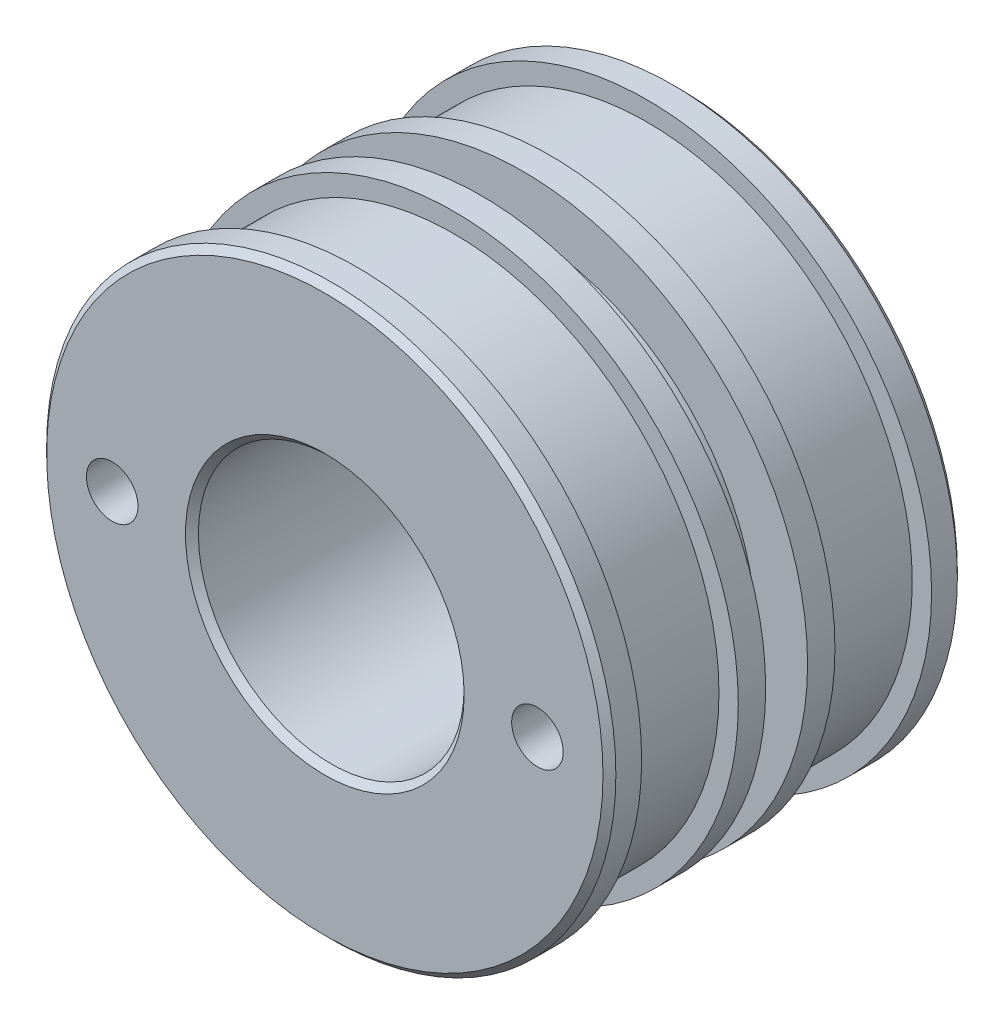
ISO-10303-21;
HEADER;
FILE_DESCRIPTION(('STEP AP214'),'2;1');
FILE_NAME('part.step','',(''),(''),'','','');
FILE_SCHEMA(('AUTOMOTIVE_DESIGN { 1 0 10303 214 1 1 1 1 }'));
ENDSEC;
DATA;
#1=APPLICATION_CONTEXT('core data for automotive mechanical design processes');
#2=APPLICATION_PROTOCOL_DEFINITION('international standard','automotive_design',2000,#1);
#3=PRODUCT_CONTEXT('',#1,'mechanical');
#4=PRODUCT('Part','Part','',(#3));
#5=PRODUCT_RELATED_PRODUCT_CATEGORY('part','',(#4));
#6=PRODUCT_DEFINITION_FORMATION('','',#4);
#7=PRODUCT_DEFINITION_CONTEXT('part definition',#1,'design');
#8=PRODUCT_DEFINITION('design','',#6,#7);
#9=PRODUCT_DEFINITION_SHAPE('','',#8);
#10=(LENGTH_UNIT() NAMED_UNIT(*) SI_UNIT(.MILLI.,.METRE.));
#11=(NAMED_UNIT(*) PLANE_ANGLE_UNIT() SI_UNIT($,.RADIAN.));
#12=(NAMED_UNIT(*) SI_UNIT($,.STERADIAN.) SOLID_ANGLE_UNIT());
#13=UNCERTAINTY_MEASURE_WITH_UNIT(LENGTH_MEASURE(1.E-05),#10,'distance_accuracy_value','');
#14=(GEOMETRIC_REPRESENTATION_CONTEXT(3) GLOBAL_UNCERTAINTY_ASSIGNED_CONTEXT((#13)) GLOBAL_UNIT_ASSIGNED_CONTEXT((#10,
#11,#12)) REPRESENTATION_CONTEXT('',''));
#15=CARTESIAN_POINT('',(0.,0.,0.));
#16=DIRECTION('',(0.,0.,1.));
#17=DIRECTION('',(1.,0.,0.));
#18=AXIS2_PLACEMENT_3D('',#15,#16,#17);
#19=CARTESIAN_POINT('',(0.,0.,-55.));
#20=DIRECTION('',(0.,0.,1.));
#21=DIRECTION('',(1.,0.,0.));
#22=AXIS2_PLACEMENT_3D('',#19,#20,#21);
#23=CYLINDRICAL_SURFACE('',#22,20.625);
#24=CARTESIAN_POINT('',(0.,0.,-1.00000000000002));
#25=DIRECTION('',(0.,0.,1.));
#26=DIRECTION('',(1.,0.,0.));
#27=AXIS2_PLACEMENT_3D('',#24,#25,#26);
#28=CIRCLE('',#27,20.625);
#29=CARTESIAN_POINT('',(20.625,0.,-1.00000000000002));
#30=VERTEX_POINT('',#29);
#31=EDGE_CURVE('E65',#30,#30,#28,.T.);
#32=ORIENTED_EDGE('',*,*,#31,.T.);
#33=EDGE_LOOP('',(#32));
#34=FACE_BOUND('',#33,.T.);
#35=CARTESIAN_POINT('',(0.,0.,-40.));
#36=DIRECTION('',(0.,0.,-1.));
#37=DIRECTION('',(-1.,0.,0.));
#38=AXIS2_PLACEMENT_3D('',#35,#36,#37);
#39=CIRCLE('',#38,20.625);
#40=CARTESIAN_POINT('',(-20.625,0.,-40.));
#41=VERTEX_POINT('',#40);
#42=EDGE_CURVE('E55',#41,#41,#39,.F.);
#43=ORIENTED_EDGE('',*,*,#42,.F.);
#44=EDGE_LOOP('',(#43));
#45=FACE_BOUND('',#44,.T.);
#46=ADVANCED_FACE('F36',(#34,#45),#23,.F.);
#47=CARTESIAN_POINT('',(0.,0.,-55.));
#48=DIRECTION('',(0.,0.,1.));
#49=DIRECTION('',(1.,0.,0.));
#50=AXIS2_PLACEMENT_3D('',#47,#48,#49);
#51=CYLINDRICAL_SURFACE('',#50,44.175);
#52=CARTESIAN_POINT('',(0.,0.,-1.00000000000004));
#53=DIRECTION('',(0.,0.,1.));
#54=DIRECTION('',(1.,0.,0.));
#55=AXIS2_PLACEMENT_3D('',#52,#53,#54);
#56=CIRCLE('',#55,44.175);
#57=CARTESIAN_POINT('',(44.175,0.,-1.00000000000004));
#58=VERTEX_POINT('',#57);
#59=EDGE_CURVE('E48',#58,#58,#56,.F.);
#60=ORIENTED_EDGE('',*,*,#59,.T.);
#61=EDGE_LOOP('',(#60));
#62=FACE_BOUND('',#61,.T.);
#63=CARTESIAN_POINT('',(0.,0.,-5.));
#64=DIRECTION('',(0.,0.,1.));
#65=DIRECTION('',(1.,0.,0.));
#66=AXIS2_PLACEMENT_3D('',#63,#64,#65);
#67=CIRCLE('',#66,44.175);
#68=CARTESIAN_POINT('',(44.175,0.,-5.));
#69=VERTEX_POINT('',#68);
#70=EDGE_CURVE('E90',#69,#69,#67,.T.);
#71=ORIENTED_EDGE('',*,*,#70,.T.);
#72=EDGE_LOOP('',(#71));
#73=FACE_BOUND('',#72,.T.);
#74=ADVANCED_FACE('F163',(#62,#73),#51,.T.);
#75=CARTESIAN_POINT('',(0.,0.,-54.));
#76=DIRECTION('',(0.,0.,1.));
#77=DIRECTION('',(1.,0.,0.));
#78=AXIS2_PLACEMENT_3D('',#75,#76,#77);
#79=CIRCLE('',#78,44.175);
#80=CARTESIAN_POINT('',(44.175,0.,-54.));
#81=VERTEX_POINT('',#80);
#82=EDGE_CURVE('E71',#81,#81,#79,.T.);
#83=ORIENTED_EDGE('',*,*,#82,.T.);
#84=EDGE_LOOP('',(#83));
#85=FACE_BOUND('',#84,.T.);
#86=CARTESIAN_POINT('',(0.,0.,-50.));
#87=DIRECTION('',(0.,0.,1.));
#88=DIRECTION('',(1.,0.,0.));
#89=AXIS2_PLACEMENT_3D('',#86,#87,#88);
#90=CIRCLE('',#89,44.175);
#91=CARTESIAN_POINT('',(44.175,0.,-50.));
#92=VERTEX_POINT('',#91);
#93=EDGE_CURVE('E82',#92,#92,#90,.T.);
#94=ORIENTED_EDGE('',*,*,#93,.F.);
#95=EDGE_LOOP('',(#94));
#96=FACE_BOUND('',#95,.T.);
#97=ADVANCED_FACE('F169',(#85,#96),#51,.T.);
#98=CARTESIAN_POINT('',(0.,0.,-55.));
#99=DIRECTION('',(0.,0.,1.));
#100=DIRECTION('',(1.,0.,0.));
#101=AXIS2_PLACEMENT_3D('',#98,#99,#100);
#102=PLANE('',#101);
#103=CARTESIAN_POINT('',(0.,0.,-55.));
#104=DIRECTION('',(0.,0.,1.));
#105=DIRECTION('',(1.,0.,0.));
#106=AXIS2_PLACEMENT_3D('',#103,#104,#105);
#107=CIRCLE('',#106,25.5);
#108=CARTESIAN_POINT('',(25.5,0.,-55.));
#109=VERTEX_POINT('',#108);
#110=EDGE_CURVE('E10',#109,#109,#107,.T.);
#111=ORIENTED_EDGE('',*,*,#110,.T.);
#112=EDGE_LOOP('',(#111));
#113=FACE_BOUND('',#112,.T.);
#114=CARTESIAN_POINT('',(0.,0.,-55.));
#115=DIRECTION('',(0.,0.,1.));
#116=DIRECTION('',(1.,0.,0.));
#117=AXIS2_PLACEMENT_3D('',#114,#115,#116);
#118=CIRCLE('',#117,43.175);
#119=CARTESIAN_POINT('',(43.175,0.,-55.));
#120=VERTEX_POINT('',#119);
#121=EDGE_CURVE('E68',#120,#120,#118,.F.);
#122=ORIENTED_EDGE('',*,*,#121,.T.);
#123=EDGE_LOOP('',(#122));
#124=FACE_BOUND('',#123,.T.);
#125=ADVANCED_FACE('F137',(#113,#124),#102,.F.);
#126=CARTESIAN_POINT('',(0.,0.,0.));
#127=DIRECTION('',(0.,0.,1.));
#128=DIRECTION('',(1.,0.,0.));
#129=AXIS2_PLACEMENT_3D('',#126,#127,#128);
#130=PLANE('',#129);
#131=CARTESIAN_POINT('',(-33.,0.,0.));
#132=DIRECTION('',(0.,0.,1.));
#133=DIRECTION('',(1.,0.,0.));
#134=AXIS2_PLACEMENT_3D('',#131,#132,#133);
#135=CIRCLE('',#134,4.);
#136=CARTESIAN_POINT('',(-29.,0.,0.));
#137=VERTEX_POINT('',#136);
#138=EDGE_CURVE('E118',#137,#137,#135,.T.);
#139=ORIENTED_EDGE('',*,*,#138,.F.);
#140=EDGE_LOOP('',(#139));
#141=FACE_BOUND('',#140,.T.);
#142=CARTESIAN_POINT('',(33.,0.,0.));
#143=DIRECTION('',(0.,0.,1.));
#144=DIRECTION('',(1.,0.,0.));
#145=AXIS2_PLACEMENT_3D('',#142,#143,#144);
#146=CIRCLE('',#145,4.00000000000001);
#147=CARTESIAN_POINT('',(37.,0.,0.));
#148=VERTEX_POINT('',#147);
#149=EDGE_CURVE('E112',#148,#148,#146,.T.);
#150=ORIENTED_EDGE('',*,*,#149,.F.);
#151=EDGE_LOOP('',(#150));
#152=FACE_BOUND('',#151,.T.);
#153=CARTESIAN_POINT('',(0.,0.,0.));
#154=DIRECTION('',(0.,0.,1.));
#155=DIRECTION('',(1.,0.,0.));
#156=AXIS2_PLACEMENT_3D('',#153,#154,#155);
#157=CIRCLE('',#156,21.625);
#158=CARTESIAN_POINT('',(21.625,0.,0.));
#159=VERTEX_POINT('',#158);
#160=EDGE_CURVE('E52',#159,#159,#157,.F.);
#161=ORIENTED_EDGE('',*,*,#160,.T.);
#162=EDGE_LOOP('',(#161));
#163=FACE_BOUND('',#162,.T.);
#164=CARTESIAN_POINT('',(0.,0.,0.));
#165=DIRECTION('',(0.,0.,1.));
#166=DIRECTION('',(1.,0.,0.));
#167=AXIS2_PLACEMENT_3D('',#164,#165,#166);
#168=CIRCLE('',#167,43.175);
#169=CARTESIAN_POINT('',(43.175,0.,0.));
#170=VERTEX_POINT('',#169);
#171=EDGE_CURVE('E62',#170,#170,#168,.T.);
#172=ORIENTED_EDGE('',*,*,#171,.T.);
#173=EDGE_LOOP('',(#172));
#174=FACE_BOUND('',#173,.T.);
#175=ADVANCED_FACE('F133',(#141,#152,#163,#174),#130,.T.);
#176=CARTESIAN_POINT('',(0.,44.175,-35.));
#177=DIRECTION('',(0.,0.,-1.));
#178=DIRECTION('',(-1.,0.,0.));
#179=AXIS2_PLACEMENT_3D('',#176,#177,#178);
#180=PLANE('',#179);
#181=CARTESIAN_POINT('',(0.,0.,-35.));
#182=DIRECTION('',(0.,0.,1.));
#183=DIRECTION('',(1.,0.,0.));
#184=AXIS2_PLACEMENT_3D('',#181,#182,#183);
#185=CIRCLE('',#184,41.175);
#186=CARTESIAN_POINT('',(41.175,0.,-35.));
#187=VERTEX_POINT('',#186);
#188=EDGE_CURVE('E75',#187,#187,#185,.T.);
#189=ORIENTED_EDGE('',*,*,#188,.T.);
#190=EDGE_LOOP('',(#189));
#191=FACE_BOUND('',#190,.T.);
#192=CARTESIAN_POINT('',(0.,0.,-35.));
#193=DIRECTION('',(0.,0.,1.));
#194=DIRECTION('',(1.,0.,0.));
#195=AXIS2_PLACEMENT_3D('',#192,#193,#194);
#196=CIRCLE('',#195,44.175);
#197=CARTESIAN_POINT('',(44.175,0.,-35.));
#198=VERTEX_POINT('',#197);
#199=EDGE_CURVE('E57',#198,#198,#196,.T.);
#200=ORIENTED_EDGE('',*,*,#199,.F.);
#201=EDGE_LOOP('',(#200));
#202=FACE_BOUND('',#201,.T.);
#203=ADVANCED_FACE('F136',(#191,#202),#180,.T.);
#204=CARTESIAN_POINT('',(0.,0.,0.));
#205=DIRECTION('',(0.,0.,1.));
#206=DIRECTION('',(1.,0.,0.));
#207=AXIS2_PLACEMENT_3D('',#204,#205,#206);
#208=CYLINDRICAL_SURFACE('',#207,41.175);
#209=CARTESIAN_POINT('',(0.,0.,-50.));
#210=DIRECTION('',(0.,0.,1.));
#211=DIRECTION('',(1.,0.,0.));
#212=AXIS2_PLACEMENT_3D('',#209,#210,#211);
#213=CIRCLE('',#212,41.175);
#214=CARTESIAN_POINT('',(41.175,0.,-50.));
#215=VERTEX_POINT('',#214);
#216=EDGE_CURVE('E79',#215,#215,#213,.T.);
#217=ORIENTED_EDGE('',*,*,#216,.T.);
#218=EDGE_LOOP('',(#217));
#219=FACE_BOUND('',#218,.T.);
#220=ORIENTED_EDGE('',*,*,#188,.F.);
#221=EDGE_LOOP('',(#220));
#222=FACE_BOUND('',#221,.T.);
#223=ADVANCED_FACE('F210',(#219,#222),#208,.T.);
#224=CARTESIAN_POINT('',(0.,44.175,-50.));
#225=DIRECTION('',(0.,0.,1.));
#226=DIRECTION('',(1.,0.,0.));
#227=AXIS2_PLACEMENT_3D('',#224,#225,#226);
#228=PLANE('',#227);
#229=ORIENTED_EDGE('',*,*,#93,.T.);
#230=EDGE_LOOP('',(#229));
#231=FACE_BOUND('',#230,.T.);
#232=ORIENTED_EDGE('',*,*,#216,.F.);
#233=EDGE_LOOP('',(#232));
#234=FACE_BOUND('',#233,.T.);
#235=ADVANCED_FACE('F207',(#231,#234),#228,.T.);
#236=ORIENTED_EDGE('',*,*,#199,.T.);
#237=EDGE_LOOP('',(#236));
#238=FACE_BOUND('',#237,.T.);
#239=CARTESIAN_POINT('',(0.,0.,-30.75));
#240=DIRECTION('',(0.,0.,1.));
#241=DIRECTION('',(1.,0.,0.));
#242=AXIS2_PLACEMENT_3D('',#239,#240,#241);
#243=CIRCLE('',#242,44.175);
#244=CARTESIAN_POINT('',(44.175,0.,-30.75));
#245=VERTEX_POINT('',#244);
#246=EDGE_CURVE('E94',#245,#245,#243,.T.);
#247=ORIENTED_EDGE('',*,*,#246,.F.);
#248=EDGE_LOOP('',(#247));
#249=FACE_BOUND('',#248,.T.);
#250=ADVANCED_FACE('F204',(#238,#249),#51,.T.);
#251=CARTESIAN_POINT('',(0.,44.175,-24.25));
#252=DIRECTION('',(0.,0.,-1.));
#253=DIRECTION('',(-1.,0.,0.));
#254=AXIS2_PLACEMENT_3D('',#251,#252,#253);
#255=PLANE('',#254);
#256=CARTESIAN_POINT('',(0.,0.,-24.25));
#257=DIRECTION('',(0.,0.,1.));
#258=DIRECTION('',(1.,0.,0.));
#259=AXIS2_PLACEMENT_3D('',#256,#257,#258);
#260=CIRCLE('',#259,36.175);
#261=CARTESIAN_POINT('',(36.175,0.,-24.25));
#262=VERTEX_POINT('',#261);
#263=EDGE_CURVE('E87',#262,#262,#260,.T.);
#264=ORIENTED_EDGE('',*,*,#263,.T.);
#265=EDGE_LOOP('',(#264));
#266=FACE_BOUND('',#265,.T.);
#267=CARTESIAN_POINT('',(0.,0.,-24.25));
#268=DIRECTION('',(0.,0.,1.));
#269=DIRECTION('',(1.,0.,0.));
#270=AXIS2_PLACEMENT_3D('',#267,#268,#269);
#271=CIRCLE('',#270,44.175);
#272=CARTESIAN_POINT('',(44.175,0.,-24.25));
#273=VERTEX_POINT('',#272);
#274=EDGE_CURVE('E78',#273,#273,#271,.T.);
#275=ORIENTED_EDGE('',*,*,#274,.F.);
#276=EDGE_LOOP('',(#275));
#277=FACE_BOUND('',#276,.T.);
#278=ADVANCED_FACE('F224',(#266,#277),#255,.T.);
#279=CARTESIAN_POINT('',(0.,0.,0.));
#280=DIRECTION('',(0.,0.,1.));
#281=DIRECTION('',(1.,0.,0.));
#282=AXIS2_PLACEMENT_3D('',#279,#280,#281);
#283=CYLINDRICAL_SURFACE('',#282,36.175);
#284=CARTESIAN_POINT('',(0.,0.,-30.75));
#285=DIRECTION('',(0.,0.,1.));
#286=DIRECTION('',(1.,0.,0.));
#287=AXIS2_PLACEMENT_3D('',#284,#285,#286);
#288=CIRCLE('',#287,36.175);
#289=CARTESIAN_POINT('',(36.175,0.,-30.75));
#290=VERTEX_POINT('',#289);
#291=EDGE_CURVE('E91',#290,#290,#288,.T.);
#292=ORIENTED_EDGE('',*,*,#291,.T.);
#293=EDGE_LOOP('',(#292));
#294=FACE_BOUND('',#293,.T.);
#295=ORIENTED_EDGE('',*,*,#263,.F.);
#296=EDGE_LOOP('',(#295));
#297=FACE_BOUND('',#296,.T.);
#298=ADVANCED_FACE('F230',(#294,#297),#283,.T.);
#299=CARTESIAN_POINT('',(0.,44.175,-30.75));
#300=DIRECTION('',(0.,0.,1.));
#301=DIRECTION('',(1.,0.,0.));
#302=AXIS2_PLACEMENT_3D('',#299,#300,#301);
#303=PLANE('',#302);
#304=ORIENTED_EDGE('',*,*,#246,.T.);
#305=EDGE_LOOP('',(#304));
#306=FACE_BOUND('',#305,.T.);
#307=ORIENTED_EDGE('',*,*,#291,.F.);
#308=EDGE_LOOP('',(#307));
#309=FACE_BOUND('',#308,.T.);
#310=ADVANCED_FACE('F227',(#306,#309),#303,.T.);
#311=ORIENTED_EDGE('',*,*,#274,.T.);
#312=EDGE_LOOP('',(#311));
#313=FACE_BOUND('',#312,.T.);
#314=CARTESIAN_POINT('',(0.,0.,-20.));
#315=DIRECTION('',(0.,0.,1.));
#316=DIRECTION('',(1.,0.,0.));
#317=AXIS2_PLACEMENT_3D('',#314,#315,#316);
#318=CIRCLE('',#317,44.175);
#319=CARTESIAN_POINT('',(44.175,0.,-20.));
#320=VERTEX_POINT('',#319);
#321=EDGE_CURVE('E104',#320,#320,#318,.T.);
#322=ORIENTED_EDGE('',*,*,#321,.F.);
#323=EDGE_LOOP('',(#322));
#324=FACE_BOUND('',#323,.T.);
#325=ADVANCED_FACE('F172',(#313,#324),#51,.T.);
#326=CARTESIAN_POINT('',(0.,44.175,-5.));
#327=DIRECTION('',(0.,0.,-1.));
#328=DIRECTION('',(-1.,0.,0.));
#329=AXIS2_PLACEMENT_3D('',#326,#327,#328);
#330=PLANE('',#329);
#331=CARTESIAN_POINT('',(0.,0.,-5.));
#332=DIRECTION('',(0.,0.,1.));
#333=DIRECTION('',(1.,0.,0.));
#334=AXIS2_PLACEMENT_3D('',#331,#332,#333);
#335=CIRCLE('',#334,41.175);
#336=CARTESIAN_POINT('',(41.175,0.,-5.));
#337=VERTEX_POINT('',#336);
#338=EDGE_CURVE('E74',#337,#337,#335,.T.);
#339=ORIENTED_EDGE('',*,*,#338,.T.);
#340=EDGE_LOOP('',(#339));
#341=FACE_BOUND('',#340,.T.);
#342=ORIENTED_EDGE('',*,*,#70,.F.);
#343=EDGE_LOOP('',(#342));
#344=FACE_BOUND('',#343,.T.);
#345=ADVANCED_FACE('F246',(#341,#344),#330,.T.);
#346=CARTESIAN_POINT('',(0.,0.,0.));
#347=DIRECTION('',(0.,0.,1.));
#348=DIRECTION('',(1.,0.,0.));
#349=AXIS2_PLACEMENT_3D('',#346,#347,#348);
#350=CYLINDRICAL_SURFACE('',#349,41.175);
#351=CARTESIAN_POINT('',(0.,0.,-20.));
#352=DIRECTION('',(0.,0.,1.));
#353=DIRECTION('',(1.,0.,0.));
#354=AXIS2_PLACEMENT_3D('',#351,#352,#353);
#355=CIRCLE('',#354,41.175);
#356=CARTESIAN_POINT('',(41.175,0.,-20.));
#357=VERTEX_POINT('',#356);
#358=EDGE_CURVE('E101',#357,#357,#355,.T.);
#359=ORIENTED_EDGE('',*,*,#358,.T.);
#360=EDGE_LOOP('',(#359));
#361=FACE_BOUND('',#360,.T.);
#362=ORIENTED_EDGE('',*,*,#338,.F.);
#363=EDGE_LOOP('',(#362));
#364=FACE_BOUND('',#363,.T.);
#365=ADVANCED_FACE('F195',(#361,#364),#350,.T.);
#366=CARTESIAN_POINT('',(0.,44.175,-20.));
#367=DIRECTION('',(0.,0.,1.));
#368=DIRECTION('',(1.,0.,0.));
#369=AXIS2_PLACEMENT_3D('',#366,#367,#368);
#370=PLANE('',#369);
#371=ORIENTED_EDGE('',*,*,#321,.T.);
#372=EDGE_LOOP('',(#371));
#373=FACE_BOUND('',#372,.T.);
#374=ORIENTED_EDGE('',*,*,#358,.F.);
#375=EDGE_LOOP('',(#374));
#376=FACE_BOUND('',#375,.T.);
#377=ADVANCED_FACE('F184',(#373,#376),#370,.T.);
#378=CARTESIAN_POINT('',(0.,0.,-54.));
#379=DIRECTION('',(0.,0.,1.));
#380=DIRECTION('',(1.,0.,0.));
#381=AXIS2_PLACEMENT_3D('',#378,#379,#380);
#382=CONICAL_SURFACE('',#381,44.175,0.785398163397459);
#383=ORIENTED_EDGE('',*,*,#121,.F.);
#384=EDGE_LOOP('',(#383));
#385=FACE_BOUND('',#384,.T.);
#386=ORIENTED_EDGE('',*,*,#82,.F.);
#387=EDGE_LOOP('',(#386));
#388=FACE_BOUND('',#387,.T.);
#389=ADVANCED_FACE('F157',(#385,#388),#382,.T.);
#390=CARTESIAN_POINT('',(0.,0.,-1.00000000000002));
#391=DIRECTION('',(0.,0.,1.));
#392=DIRECTION('',(1.,0.,0.));
#393=AXIS2_PLACEMENT_3D('',#390,#391,#392);
#394=CONICAL_SURFACE('',#393,20.625,0.785398163397453);
#395=ORIENTED_EDGE('',*,*,#160,.F.);
#396=EDGE_LOOP('',(#395));
#397=FACE_BOUND('',#396,.T.);
#398=ORIENTED_EDGE('',*,*,#31,.F.);
#399=EDGE_LOOP('',(#398));
#400=FACE_BOUND('',#399,.T.);
#401=ADVANCED_FACE('F148',(#397,#400),#394,.F.);
#402=CARTESIAN_POINT('',(0.,0.,0.));
#403=DIRECTION('',(0.,0.,-1.));
#404=DIRECTION('',(-1.,0.,0.));
#405=AXIS2_PLACEMENT_3D('',#402,#403,#404);
#406=CONICAL_SURFACE('',#405,43.175,0.785398163397434);
#407=ORIENTED_EDGE('',*,*,#59,.F.);
#408=EDGE_LOOP('',(#407));
#409=FACE_BOUND('',#408,.T.);
#410=ORIENTED_EDGE('',*,*,#171,.F.);
#411=EDGE_LOOP('',(#410));
#412=FACE_BOUND('',#411,.T.);
#413=ADVANCED_FACE('F145',(#409,#412),#406,.T.);
#414=CARTESIAN_POINT('',(0.,0.,-40.));
#415=DIRECTION('',(0.,0.,-1.));
#416=DIRECTION('',(-1.,0.,0.));
#417=AXIS2_PLACEMENT_3D('',#414,#415,#416);
#418=PLANE('',#417);
#419=CARTESIAN_POINT('',(0.,0.,-40.));
#420=DIRECTION('',(0.,0.,-1.));
#421=DIRECTION('',(-1.,0.,0.));
#422=AXIS2_PLACEMENT_3D('',#419,#420,#421);
#423=CIRCLE('',#422,24.5);
#424=CARTESIAN_POINT('',(-24.5,0.,-40.));
#425=VERTEX_POINT('',#424);
#426=EDGE_CURVE('E58',#425,#425,#423,.T.);
#427=ORIENTED_EDGE('',*,*,#426,.T.);
#428=EDGE_LOOP('',(#427));
#429=FACE_BOUND('',#428,.T.);
#430=ORIENTED_EDGE('',*,*,#42,.T.);
#431=EDGE_LOOP('',(#430));
#432=FACE_BOUND('',#431,.T.);
#433=ADVANCED_FACE('F147',(#429,#432),#418,.T.);
#434=CARTESIAN_POINT('',(0.,0.,-40.));
#435=DIRECTION('',(0.,0.,-1.));
#436=DIRECTION('',(-1.,0.,0.));
#437=AXIS2_PLACEMENT_3D('',#434,#435,#436);
#438=CYLINDRICAL_SURFACE('',#437,24.5);
#439=CARTESIAN_POINT('',(0.,0.,-54.));
#440=DIRECTION('',(0.,0.,1.));
#441=DIRECTION('',(1.,0.,0.));
#442=AXIS2_PLACEMENT_3D('',#439,#440,#441);
#443=CIRCLE('',#442,24.5);
#444=CARTESIAN_POINT('',(24.5,0.,-54.));
#445=VERTEX_POINT('',#444);
#446=EDGE_CURVE('E44',#445,#445,#443,.F.);
#447=ORIENTED_EDGE('',*,*,#446,.T.);
#448=EDGE_LOOP('',(#447));
#449=FACE_BOUND('',#448,.T.);
#450=ORIENTED_EDGE('',*,*,#426,.F.);
#451=EDGE_LOOP('',(#450));
#452=FACE_BOUND('',#451,.T.);
#453=ADVANCED_FACE('F154',(#449,#452),#438,.F.);
#454=CARTESIAN_POINT('',(0.,0.,-54.));
#455=DIRECTION('',(0.,0.,-1.));
#456=DIRECTION('',(-1.,0.,0.));
#457=AXIS2_PLACEMENT_3D('',#454,#455,#456);
#458=CONICAL_SURFACE('',#457,24.5,0.785398163397452);
#459=ORIENTED_EDGE('',*,*,#110,.F.);
#460=EDGE_LOOP('',(#459));
#461=FACE_BOUND('',#460,.T.);
#462=ORIENTED_EDGE('',*,*,#446,.F.);
#463=EDGE_LOOP('',(#462));
#464=FACE_BOUND('',#463,.T.);
#465=ADVANCED_FACE('F39',(#461,#464),#458,.F.);
#466=CARTESIAN_POINT('',(33.,0.,-9.));
#467=DIRECTION('',(0.,0.,1.));
#468=DIRECTION('',(1.,0.,0.));
#469=AXIS2_PLACEMENT_3D('',#466,#467,#468);
#470=CYLINDRICAL_SURFACE('',#469,4.00000000000001);
#471=CARTESIAN_POINT('',(33.,0.,-9.));
#472=DIRECTION('',(0.,0.,1.));
#473=DIRECTION('',(1.,0.,0.));
#474=AXIS2_PLACEMENT_3D('',#471,#472,#473);
#475=CIRCLE('',#474,4.00000000000001);
#476=CARTESIAN_POINT('',(37.,0.,-9.));
#477=VERTEX_POINT('',#476);
#478=EDGE_CURVE('E115',#477,#477,#475,.T.);
#479=ORIENTED_EDGE('',*,*,#478,.F.);
#480=EDGE_LOOP('',(#479));
#481=FACE_BOUND('',#480,.T.);
#482=ORIENTED_EDGE('',*,*,#149,.T.);
#483=EDGE_LOOP('',(#482));
#484=FACE_BOUND('',#483,.T.);
#485=ADVANCED_FACE('F266',(#481,#484),#470,.F.);
#486=CARTESIAN_POINT('',(33.,0.,-9.));
#487=DIRECTION('',(0.,0.,1.));
#488=DIRECTION('',(1.,0.,0.));
#489=AXIS2_PLACEMENT_3D('',#486,#487,#488);
#490=PLANE('',#489);
#491=ORIENTED_EDGE('',*,*,#478,.T.);
#492=EDGE_LOOP('',(#491));
#493=FACE_BOUND('',#492,.T.);
#494=ADVANCED_FACE('F129',(#493),#490,.T.);
#495=CARTESIAN_POINT('',(-33.,0.,-9.));
#496=DIRECTION('',(0.,0.,1.));
#497=DIRECTION('',(1.,0.,0.));
#498=AXIS2_PLACEMENT_3D('',#495,#496,#497);
#499=CYLINDRICAL_SURFACE('',#498,4.);
#500=CARTESIAN_POINT('',(-33.,0.,-9.));
#501=DIRECTION('',(0.,0.,1.));
#502=DIRECTION('',(1.,0.,0.));
#503=AXIS2_PLACEMENT_3D('',#500,#501,#502);
#504=CIRCLE('',#503,4.);
#505=CARTESIAN_POINT('',(-29.,0.,-9.));
#506=VERTEX_POINT('',#505);
#507=EDGE_CURVE('E111',#506,#506,#504,.T.);
#508=ORIENTED_EDGE('',*,*,#507,.F.);
#509=EDGE_LOOP('',(#508));
#510=FACE_BOUND('',#509,.T.);
#511=ORIENTED_EDGE('',*,*,#138,.T.);
#512=EDGE_LOOP('',(#511));
#513=FACE_BOUND('',#512,.T.);
#514=ADVANCED_FACE('F126',(#510,#513),#499,.F.);
#515=CARTESIAN_POINT('',(-33.,0.,-9.));
#516=DIRECTION('',(0.,0.,1.));
#517=DIRECTION('',(1.,0.,0.));
#518=AXIS2_PLACEMENT_3D('',#515,#516,#517);
#519=PLANE('',#518);
#520=ORIENTED_EDGE('',*,*,#507,.T.);
#521=EDGE_LOOP('',(#520));
#522=FACE_BOUND('',#521,.T.);
#523=ADVANCED_FACE('F124',(#522),#519,.T.);
#524=CLOSED_SHELL('',(#46,#74,#97,#125,#175,#203,#223,#235,#250,#278,#298,#310,#325,#345,#365,
#377,#389,#401,#413,#433,#453,#465,#485,#494,#514,#523));
#525=MANIFOLD_SOLID_BREP('B2',#524);
#526=ADVANCED_BREP_SHAPE_REPRESENTATION('',(#18,#525),#14);
#527=SHAPE_DEFINITION_REPRESENTATION(#9,#526);
ENDSEC;
END-ISO-10303-21;
